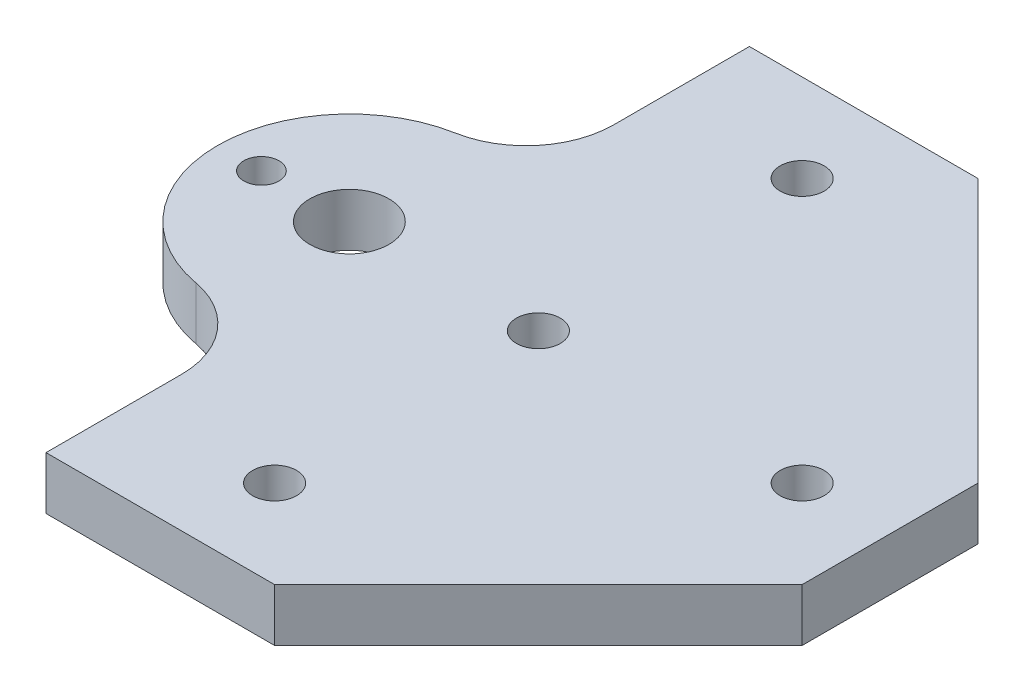
ISO-10303-21;
HEADER;
FILE_DESCRIPTION(('STEP AP214'),'2;1');
FILE_NAME('part.step','',(''),(''),'','','');
FILE_SCHEMA(('AUTOMOTIVE_DESIGN { 1 0 10303 214 1 1 1 1 }'));
ENDSEC;
DATA;
#1=APPLICATION_CONTEXT('core data for automotive mechanical design processes');
#2=APPLICATION_PROTOCOL_DEFINITION('international standard','automotive_design',2000,#1);
#3=PRODUCT_CONTEXT('',#1,'mechanical');
#4=PRODUCT('Part','Part','',(#3));
#5=PRODUCT_RELATED_PRODUCT_CATEGORY('part','',(#4));
#6=PRODUCT_DEFINITION_FORMATION('','',#4);
#7=PRODUCT_DEFINITION_CONTEXT('part definition',#1,'design');
#8=PRODUCT_DEFINITION('design','',#6,#7);
#9=PRODUCT_DEFINITION_SHAPE('','',#8);
#10=(LENGTH_UNIT() NAMED_UNIT(*) SI_UNIT(.MILLI.,.METRE.));
#11=(NAMED_UNIT(*) PLANE_ANGLE_UNIT() SI_UNIT($,.RADIAN.));
#12=(NAMED_UNIT(*) SI_UNIT($,.STERADIAN.) SOLID_ANGLE_UNIT());
#13=UNCERTAINTY_MEASURE_WITH_UNIT(LENGTH_MEASURE(1.E-05),#10,'distance_accuracy_value','');
#14=(GEOMETRIC_REPRESENTATION_CONTEXT(3) GLOBAL_UNCERTAINTY_ASSIGNED_CONTEXT((#13)) GLOBAL_UNIT_ASSIGNED_CONTEXT((#10,
#11,#12)) REPRESENTATION_CONTEXT('',''));
#15=CARTESIAN_POINT('',(0.,0.,0.));
#16=DIRECTION('',(0.,0.,1.));
#17=DIRECTION('',(1.,0.,0.));
#18=AXIS2_PLACEMENT_3D('',#15,#16,#17);
#19=CARTESIAN_POINT('',(0.,6.,0.));
#20=DIRECTION('',(-1.,0.,0.));
#21=DIRECTION('',(0.,0.,1.));
#22=AXIS2_PLACEMENT_3D('',#19,#20,#21);
#23=PLANE('',#22);
#24=DIRECTION('',(0.,0.,-1.));
#25=VECTOR('',#24,1.);
#26=CARTESIAN_POINT('',(0.,0.,0.));
#27=LINE('',#26,#25);
#28=CARTESIAN_POINT('',(0.,0.,10.));
#29=VERTEX_POINT('',#28);
#30=CARTESIAN_POINT('',(0.,0.,-10.));
#31=VERTEX_POINT('',#30);
#32=EDGE_CURVE('E122',#29,#31,#27,.T.);
#33=ORIENTED_EDGE('',*,*,#32,.T.);
#34=DIRECTION('',(0.,-1.,0.));
#35=VECTOR('',#34,1.);
#36=CARTESIAN_POINT('',(0.,6.,-10.));
#37=LINE('',#36,#35);
#38=CARTESIAN_POINT('',(0.,6.,-10.));
#39=VERTEX_POINT('',#38);
#40=EDGE_CURVE('E121',#39,#31,#37,.T.);
#41=ORIENTED_EDGE('',*,*,#40,.F.);
#42=DIRECTION('',(0.,0.,-1.));
#43=VECTOR('',#42,1.);
#44=CARTESIAN_POINT('',(0.,6.,10.));
#45=LINE('',#44,#43);
#46=CARTESIAN_POINT('',(0.,6.,10.));
#47=VERTEX_POINT('',#46);
#48=EDGE_CURVE('E107',#47,#39,#45,.T.);
#49=ORIENTED_EDGE('',*,*,#48,.F.);
#50=DIRECTION('',(0.,-1.,0.));
#51=VECTOR('',#50,1.);
#52=CARTESIAN_POINT('',(0.,6.,10.));
#53=LINE('',#52,#51);
#54=EDGE_CURVE('E146',#47,#29,#53,.T.);
#55=ORIENTED_EDGE('',*,*,#54,.T.);
#56=EDGE_LOOP('',(#33,#41,#49,#55));
#57=FACE_BOUND('',#56,.T.);
#58=ADVANCED_FACE('F33',(#57),#23,.F.);
#59=CARTESIAN_POINT('',(0.,6.,-10.));
#60=DIRECTION('',(-0.707106781186548,0.,0.707106781186547));
#61=DIRECTION('',(0.707106781186547,0.,0.707106781186548));
#62=AXIS2_PLACEMENT_3D('',#59,#60,#61);
#63=PLANE('',#62);
#64=DIRECTION('',(-0.707106781186547,0.,-0.707106781186549));
#65=VECTOR('',#64,1.);
#66=CARTESIAN_POINT('',(0.,0.,-10.));
#67=LINE('',#66,#65);
#68=CARTESIAN_POINT('',(-30.,0.,-40.0000000000001));
#69=VERTEX_POINT('',#68);
#70=EDGE_CURVE('E148',#31,#69,#67,.T.);
#71=ORIENTED_EDGE('',*,*,#70,.T.);
#72=DIRECTION('',(0.,-1.,0.));
#73=VECTOR('',#72,1.);
#74=CARTESIAN_POINT('',(-30.,6.,-40.0000000000001));
#75=LINE('',#74,#73);
#76=CARTESIAN_POINT('',(-30.,6.,-40.0000000000001));
#77=VERTEX_POINT('',#76);
#78=EDGE_CURVE('E126',#77,#69,#75,.T.);
#79=ORIENTED_EDGE('',*,*,#78,.F.);
#80=DIRECTION('',(-0.707106781186547,0.,-0.707106781186549));
#81=VECTOR('',#80,1.);
#82=CARTESIAN_POINT('',(0.,6.,-10.));
#83=LINE('',#82,#81);
#84=EDGE_CURVE('E111',#39,#77,#83,.T.);
#85=ORIENTED_EDGE('',*,*,#84,.F.);
#86=ORIENTED_EDGE('',*,*,#40,.T.);
#87=EDGE_LOOP('',(#71,#79,#85,#86));
#88=FACE_BOUND('',#87,.T.);
#89=ADVANCED_FACE('F128',(#88),#63,.F.);
#90=CARTESIAN_POINT('',(-30.,6.,-40.0000000000001));
#91=DIRECTION('',(0.,0.,1.));
#92=DIRECTION('',(1.,0.,0.));
#93=AXIS2_PLACEMENT_3D('',#90,#91,#92);
#94=PLANE('',#93);
#95=DIRECTION('',(-1.,0.,0.));
#96=VECTOR('',#95,1.);
#97=CARTESIAN_POINT('',(-30.,0.,-40.0000000000001));
#98=LINE('',#97,#96);
#99=CARTESIAN_POINT('',(-56.,0.,-40.0000000000001));
#100=VERTEX_POINT('',#99);
#101=EDGE_CURVE('E151',#69,#100,#98,.T.);
#102=ORIENTED_EDGE('',*,*,#101,.T.);
#103=DIRECTION('',(0.,-1.,0.));
#104=VECTOR('',#103,1.);
#105=CARTESIAN_POINT('',(-56.,6.,-40.0000000000001));
#106=LINE('',#105,#104);
#107=CARTESIAN_POINT('',(-56.,6.,-40.0000000000001));
#108=VERTEX_POINT('',#107);
#109=EDGE_CURVE('E172',#108,#100,#106,.T.);
#110=ORIENTED_EDGE('',*,*,#109,.F.);
#111=DIRECTION('',(-1.,0.,0.));
#112=VECTOR('',#111,1.);
#113=CARTESIAN_POINT('',(-30.,6.,-40.0000000000001));
#114=LINE('',#113,#112);
#115=EDGE_CURVE('E131',#77,#108,#114,.T.);
#116=ORIENTED_EDGE('',*,*,#115,.F.);
#117=ORIENTED_EDGE('',*,*,#78,.T.);
#118=EDGE_LOOP('',(#102,#110,#116,#117));
#119=FACE_BOUND('',#118,.T.);
#120=ADVANCED_FACE('F209',(#119),#94,.F.);
#121=CARTESIAN_POINT('',(-56.,6.,-40.0000000000001));
#122=DIRECTION('',(1.,0.,0.));
#123=DIRECTION('',(0.,0.,-1.));
#124=AXIS2_PLACEMENT_3D('',#121,#122,#123);
#125=PLANE('',#124);
#126=DIRECTION('',(0.,0.,1.));
#127=VECTOR('',#126,1.);
#128=CARTESIAN_POINT('',(-56.,0.,-40.0000000000001));
#129=LINE('',#128,#127);
#130=CARTESIAN_POINT('',(-56.,0.,-24.591665254716));
#131=VERTEX_POINT('',#130);
#132=EDGE_CURVE('E153',#100,#131,#129,.T.);
#133=ORIENTED_EDGE('',*,*,#132,.T.);
#134=DIRECTION('',(0.,1.,0.));
#135=VECTOR('',#134,1.);
#136=CARTESIAN_POINT('',(-56.,6.,-24.591665254716));
#137=LINE('',#136,#135);
#138=CARTESIAN_POINT('',(-56.,6.,-24.591665254716));
#139=VERTEX_POINT('',#138);
#140=EDGE_CURVE('E180',#131,#139,#137,.T.);
#141=ORIENTED_EDGE('',*,*,#140,.T.);
#142=DIRECTION('',(0.,0.,1.));
#143=VECTOR('',#142,1.);
#144=CARTESIAN_POINT('',(-56.,6.,-40.0000000000001));
#145=LINE('',#144,#143);
#146=EDGE_CURVE('E133',#108,#139,#145,.T.);
#147=ORIENTED_EDGE('',*,*,#146,.F.);
#148=ORIENTED_EDGE('',*,*,#109,.T.);
#149=EDGE_LOOP('',(#133,#141,#147,#148));
#150=FACE_BOUND('',#149,.T.);
#151=ADVANCED_FACE('F217',(#150),#125,.F.);
#152=CARTESIAN_POINT('',(-61.5,6.,-1.04922693038559E-13));
#153=DIRECTION('',(0.,-1.,0.));
#154=DIRECTION('',(0.,0.,-1.));
#155=AXIS2_PLACEMENT_3D('',#152,#153,#154);
#156=CYLINDRICAL_SURFACE('',#155,15.);
#157=CARTESIAN_POINT('',(-61.5,6.,-1.04922693038559E-13));
#158=DIRECTION('',(0.,1.,0.));
#159=DIRECTION('',(0.,0.,1.));
#160=AXIS2_PLACEMENT_3D('',#157,#158,#159);
#161=CIRCLE('',#160,15.);
#162=CARTESIAN_POINT('',(-64.2,6.,-14.7549991528297));
#163=VERTEX_POINT('',#162);
#164=CARTESIAN_POINT('',(-64.2,6.,14.7549991528295));
#165=VERTEX_POINT('',#164);
#166=EDGE_CURVE('E139',#163,#165,#161,.T.);
#167=ORIENTED_EDGE('',*,*,#166,.F.);
#168=DIRECTION('',(0.,-1.,0.));
#169=VECTOR('',#168,1.);
#170=CARTESIAN_POINT('',(-64.2,6.,-14.7549991528297));
#171=LINE('',#170,#169);
#172=CARTESIAN_POINT('',(-64.2,0.,-14.7549991528297));
#173=VERTEX_POINT('',#172);
#174=EDGE_CURVE('E177',#163,#173,#171,.T.);
#175=ORIENTED_EDGE('',*,*,#174,.T.);
#176=CARTESIAN_POINT('',(-61.5,0.,-1.04922693038559E-13));
#177=DIRECTION('',(0.,1.,0.));
#178=DIRECTION('',(0.,0.,1.));
#179=AXIS2_PLACEMENT_3D('',#176,#177,#178);
#180=CIRCLE('',#179,15.);
#181=CARTESIAN_POINT('',(-64.2,0.,14.7549991528295));
#182=VERTEX_POINT('',#181);
#183=EDGE_CURVE('E156',#173,#182,#180,.T.);
#184=ORIENTED_EDGE('',*,*,#183,.T.);
#185=DIRECTION('',(0.,-1.,0.));
#186=VECTOR('',#185,1.);
#187=CARTESIAN_POINT('',(-64.2,6.,14.7549991528295));
#188=LINE('',#187,#186);
#189=EDGE_CURVE('E125',#182,#165,#188,.F.);
#190=ORIENTED_EDGE('',*,*,#189,.T.);
#191=EDGE_LOOP('',(#167,#175,#184,#190));
#192=FACE_BOUND('',#191,.T.);
#193=ADVANCED_FACE('F194',(#192),#156,.T.);
#194=CARTESIAN_POINT('',(-56.,6.,13.9552857369528));
#195=DIRECTION('',(1.,0.,0.));
#196=DIRECTION('',(0.,0.,-1.));
#197=AXIS2_PLACEMENT_3D('',#194,#195,#196);
#198=PLANE('',#197);
#199=DIRECTION('',(0.,0.,1.));
#200=VECTOR('',#199,1.);
#201=CARTESIAN_POINT('',(-56.,6.,13.9552857369528));
#202=LINE('',#201,#200);
#203=CARTESIAN_POINT('',(-56.,6.,24.5916652547158));
#204=VERTEX_POINT('',#203);
#205=CARTESIAN_POINT('',(-56.,6.,39.9999999999999));
#206=VERTEX_POINT('',#205);
#207=EDGE_CURVE('E141',#204,#206,#202,.T.);
#208=ORIENTED_EDGE('',*,*,#207,.F.);
#209=DIRECTION('',(0.,1.,0.));
#210=VECTOR('',#209,1.);
#211=CARTESIAN_POINT('',(-56.,0.,24.5916652547158));
#212=LINE('',#211,#210);
#213=CARTESIAN_POINT('',(-56.,0.,24.5916652547158));
#214=VERTEX_POINT('',#213);
#215=EDGE_CURVE('E182',#204,#214,#212,.F.);
#216=ORIENTED_EDGE('',*,*,#215,.T.);
#217=DIRECTION('',(0.,0.,1.));
#218=VECTOR('',#217,1.);
#219=CARTESIAN_POINT('',(-56.,0.,13.9552857369528));
#220=LINE('',#219,#218);
#221=CARTESIAN_POINT('',(-56.,0.,39.9999999999999));
#222=VERTEX_POINT('',#221);
#223=EDGE_CURVE('E159',#214,#222,#220,.T.);
#224=ORIENTED_EDGE('',*,*,#223,.T.);
#225=DIRECTION('',(0.,-1.,0.));
#226=VECTOR('',#225,1.);
#227=CARTESIAN_POINT('',(-56.,6.,39.9999999999999));
#228=LINE('',#227,#226);
#229=EDGE_CURVE('E169',#206,#222,#228,.T.);
#230=ORIENTED_EDGE('',*,*,#229,.F.);
#231=EDGE_LOOP('',(#208,#216,#224,#230));
#232=FACE_BOUND('',#231,.T.);
#233=ADVANCED_FACE('F197',(#232),#198,.F.);
#234=CARTESIAN_POINT('',(-56.,6.,39.9999999999999));
#235=DIRECTION('',(0.,0.,-1.));
#236=DIRECTION('',(-1.,0.,0.));
#237=AXIS2_PLACEMENT_3D('',#234,#235,#236);
#238=PLANE('',#237);
#239=DIRECTION('',(1.,0.,0.));
#240=VECTOR('',#239,1.);
#241=CARTESIAN_POINT('',(-56.,0.,39.9999999999999));
#242=LINE('',#241,#240);
#243=CARTESIAN_POINT('',(-30.,0.,39.9999999999999));
#244=VERTEX_POINT('',#243);
#245=EDGE_CURVE('E161',#222,#244,#242,.T.);
#246=ORIENTED_EDGE('',*,*,#245,.T.);
#247=DIRECTION('',(0.,-1.,0.));
#248=VECTOR('',#247,1.);
#249=CARTESIAN_POINT('',(-30.,6.,39.9999999999999));
#250=LINE('',#249,#248);
#251=CARTESIAN_POINT('',(-30.,6.,39.9999999999999));
#252=VERTEX_POINT('',#251);
#253=EDGE_CURVE('E166',#252,#244,#250,.T.);
#254=ORIENTED_EDGE('',*,*,#253,.F.);
#255=DIRECTION('',(1.,0.,0.));
#256=VECTOR('',#255,1.);
#257=CARTESIAN_POINT('',(-56.,6.,39.9999999999999));
#258=LINE('',#257,#256);
#259=EDGE_CURVE('E143',#206,#252,#258,.T.);
#260=ORIENTED_EDGE('',*,*,#259,.F.);
#261=ORIENTED_EDGE('',*,*,#229,.T.);
#262=EDGE_LOOP('',(#246,#254,#260,#261));
#263=FACE_BOUND('',#262,.T.);
#264=ADVANCED_FACE('F202',(#263),#238,.F.);
#265=CARTESIAN_POINT('',(-30.,6.,39.9999999999999));
#266=DIRECTION('',(-0.707106781186546,0.,-0.707106781186549));
#267=DIRECTION('',(-0.707106781186549,0.,0.707106781186546));
#268=AXIS2_PLACEMENT_3D('',#265,#266,#267);
#269=PLANE('',#268);
#270=DIRECTION('',(0.707106781186549,0.,-0.707106781186546));
#271=VECTOR('',#270,1.);
#272=CARTESIAN_POINT('',(-30.,0.,39.9999999999999));
#273=LINE('',#272,#271);
#274=EDGE_CURVE('E118',#244,#29,#273,.T.);
#275=ORIENTED_EDGE('',*,*,#274,.T.);
#276=ORIENTED_EDGE('',*,*,#54,.F.);
#277=DIRECTION('',(0.707106781186549,0.,-0.707106781186546));
#278=VECTOR('',#277,1.);
#279=CARTESIAN_POINT('',(-30.,6.,39.9999999999999));
#280=LINE('',#279,#278);
#281=EDGE_CURVE('E114',#252,#47,#280,.T.);
#282=ORIENTED_EDGE('',*,*,#281,.F.);
#283=ORIENTED_EDGE('',*,*,#253,.T.);
#284=EDGE_LOOP('',(#275,#276,#282,#283));
#285=FACE_BOUND('',#284,.T.);
#286=ADVANCED_FACE('F205',(#285),#269,.F.);
#287=CARTESIAN_POINT('',(-61.5,6.,-1.04922693038559E-13));
#288=DIRECTION('',(0.,1.,0.));
#289=DIRECTION('',(0.,0.,1.));
#290=AXIS2_PLACEMENT_3D('',#287,#288,#289);
#291=PLANE('',#290);
#292=CARTESIAN_POINT('',(-71.5,6.,0.));
#293=DIRECTION('',(0.,1.,0.));
#294=DIRECTION('',(0.,0.,1.));
#295=AXIS2_PLACEMENT_3D('',#292,#293,#294);
#296=CIRCLE('',#295,2.);
#297=CARTESIAN_POINT('',(-71.5,6.,2.));
#298=VERTEX_POINT('',#297);
#299=EDGE_CURVE('E346',#298,#298,#296,.T.);
#300=ORIENTED_EDGE('',*,*,#299,.F.);
#301=EDGE_LOOP('',(#300));
#302=FACE_BOUND('',#301,.T.);
#303=CARTESIAN_POINT('',(-61.5,6.,-1.04922693038559E-13));
#304=DIRECTION('',(0.,1.,0.));
#305=DIRECTION('',(0.,0.,1.));
#306=AXIS2_PLACEMENT_3D('',#303,#304,#305);
#307=CIRCLE('',#306,4.5);
#308=CARTESIAN_POINT('',(-61.5,6.,4.49999999999989));
#309=VERTEX_POINT('',#308);
#310=EDGE_CURVE('E348',#309,#309,#307,.T.);
#311=ORIENTED_EDGE('',*,*,#310,.F.);
#312=EDGE_LOOP('',(#311));
#313=FACE_BOUND('',#312,.T.);
#314=CARTESIAN_POINT('',(-40.,6.,-30.0000000000001));
#315=DIRECTION('',(0.,1.,0.));
#316=DIRECTION('',(0.,0.,1.));
#317=AXIS2_PLACEMENT_3D('',#314,#315,#316);
#318=CIRCLE('',#317,2.5);
#319=CARTESIAN_POINT('',(-40.,6.,-27.5000000000001));
#320=VERTEX_POINT('',#319);
#321=EDGE_CURVE('E354',#320,#320,#318,.T.);
#322=ORIENTED_EDGE('',*,*,#321,.F.);
#323=EDGE_LOOP('',(#322));
#324=FACE_BOUND('',#323,.T.);
#325=CARTESIAN_POINT('',(-10.,6.,0.));
#326=DIRECTION('',(0.,1.,0.));
#327=DIRECTION('',(0.,0.,1.));
#328=AXIS2_PLACEMENT_3D('',#325,#326,#327);
#329=CIRCLE('',#328,2.5);
#330=CARTESIAN_POINT('',(-10.,6.,2.5));
#331=VERTEX_POINT('',#330);
#332=EDGE_CURVE('E360',#331,#331,#329,.T.);
#333=ORIENTED_EDGE('',*,*,#332,.F.);
#334=EDGE_LOOP('',(#333));
#335=FACE_BOUND('',#334,.T.);
#336=CARTESIAN_POINT('',(-40.,6.,29.9999999999999));
#337=DIRECTION('',(0.,1.,0.));
#338=DIRECTION('',(0.,0.,1.));
#339=AXIS2_PLACEMENT_3D('',#336,#337,#338);
#340=CIRCLE('',#339,2.5);
#341=CARTESIAN_POINT('',(-40.,6.,32.4999999999999));
#342=VERTEX_POINT('',#341);
#343=EDGE_CURVE('E366',#342,#342,#340,.T.);
#344=ORIENTED_EDGE('',*,*,#343,.F.);
#345=EDGE_LOOP('',(#344));
#346=FACE_BOUND('',#345,.T.);
#347=CARTESIAN_POINT('',(-40.,6.,0.));
#348=DIRECTION('',(0.,1.,0.));
#349=DIRECTION('',(0.,0.,1.));
#350=AXIS2_PLACEMENT_3D('',#347,#348,#349);
#351=CIRCLE('',#350,2.5);
#352=CARTESIAN_POINT('',(-40.,6.,2.49999999999991));
#353=VERTEX_POINT('',#352);
#354=EDGE_CURVE('E372',#353,#353,#351,.T.);
#355=ORIENTED_EDGE('',*,*,#354,.F.);
#356=EDGE_LOOP('',(#355));
#357=FACE_BOUND('',#356,.T.);
#358=ORIENTED_EDGE('',*,*,#48,.T.);
#359=ORIENTED_EDGE('',*,*,#84,.T.);
#360=ORIENTED_EDGE('',*,*,#115,.T.);
#361=ORIENTED_EDGE('',*,*,#146,.T.);
#362=CARTESIAN_POINT('',(-66.,6.,-24.591665254716));
#363=DIRECTION('',(0.,1.,0.));
#364=DIRECTION('',(0.,0.,1.));
#365=AXIS2_PLACEMENT_3D('',#362,#363,#364);
#366=CIRCLE('',#365,10.);
#367=EDGE_CURVE('E186',#139,#163,#366,.F.);
#368=ORIENTED_EDGE('',*,*,#367,.T.);
#369=ORIENTED_EDGE('',*,*,#166,.T.);
#370=CARTESIAN_POINT('',(-66.,6.,24.5916652547158));
#371=DIRECTION('',(0.,1.,0.));
#372=DIRECTION('',(0.,0.,1.));
#373=AXIS2_PLACEMENT_3D('',#370,#371,#372);
#374=CIRCLE('',#373,10.);
#375=EDGE_CURVE('E11',#165,#204,#374,.F.);
#376=ORIENTED_EDGE('',*,*,#375,.T.);
#377=ORIENTED_EDGE('',*,*,#207,.T.);
#378=ORIENTED_EDGE('',*,*,#259,.T.);
#379=ORIENTED_EDGE('',*,*,#281,.T.);
#380=EDGE_LOOP('',(#358,#359,#360,#361,#368,#369,#376,#377,#378,#379));
#381=FACE_BOUND('',#380,.T.);
#382=ADVANCED_FACE('F109',(#302,#313,#324,#335,#346,#357,#381),#291,.T.);
#383=CARTESIAN_POINT('',(-61.5,0.,-1.04922693038559E-13));
#384=DIRECTION('',(0.,1.,0.));
#385=DIRECTION('',(0.,0.,1.));
#386=AXIS2_PLACEMENT_3D('',#383,#384,#385);
#387=PLANE('',#386);
#388=CARTESIAN_POINT('',(-71.5,0.,0.));
#389=DIRECTION('',(0.,1.,0.));
#390=DIRECTION('',(0.,0.,1.));
#391=AXIS2_PLACEMENT_3D('',#388,#389,#390);
#392=CIRCLE('',#391,2.);
#393=CARTESIAN_POINT('',(-71.5,0.,2.));
#394=VERTEX_POINT('',#393);
#395=EDGE_CURVE('E343',#394,#394,#392,.T.);
#396=ORIENTED_EDGE('',*,*,#395,.T.);
#397=EDGE_LOOP('',(#396));
#398=FACE_BOUND('',#397,.T.);
#399=CARTESIAN_POINT('',(-61.5,0.,-1.04922693038559E-13));
#400=DIRECTION('',(0.,1.,0.));
#401=DIRECTION('',(0.,0.,1.));
#402=AXIS2_PLACEMENT_3D('',#399,#400,#401);
#403=CIRCLE('',#402,4.5);
#404=CARTESIAN_POINT('',(-61.5,0.,4.49999999999989));
#405=VERTEX_POINT('',#404);
#406=EDGE_CURVE('E351',#405,#405,#403,.T.);
#407=ORIENTED_EDGE('',*,*,#406,.T.);
#408=EDGE_LOOP('',(#407));
#409=FACE_BOUND('',#408,.T.);
#410=CARTESIAN_POINT('',(-40.,0.,-30.0000000000001));
#411=DIRECTION('',(0.,1.,0.));
#412=DIRECTION('',(0.,0.,1.));
#413=AXIS2_PLACEMENT_3D('',#410,#411,#412);
#414=CIRCLE('',#413,2.5);
#415=CARTESIAN_POINT('',(-40.,0.,-27.5000000000001));
#416=VERTEX_POINT('',#415);
#417=EDGE_CURVE('E357',#416,#416,#414,.T.);
#418=ORIENTED_EDGE('',*,*,#417,.T.);
#419=EDGE_LOOP('',(#418));
#420=FACE_BOUND('',#419,.T.);
#421=CARTESIAN_POINT('',(-10.,0.,0.));
#422=DIRECTION('',(0.,1.,0.));
#423=DIRECTION('',(0.,0.,1.));
#424=AXIS2_PLACEMENT_3D('',#421,#422,#423);
#425=CIRCLE('',#424,2.5);
#426=CARTESIAN_POINT('',(-10.,0.,2.5));
#427=VERTEX_POINT('',#426);
#428=EDGE_CURVE('E363',#427,#427,#425,.T.);
#429=ORIENTED_EDGE('',*,*,#428,.T.);
#430=EDGE_LOOP('',(#429));
#431=FACE_BOUND('',#430,.T.);
#432=CARTESIAN_POINT('',(-40.,0.,29.9999999999999));
#433=DIRECTION('',(0.,1.,0.));
#434=DIRECTION('',(0.,0.,1.));
#435=AXIS2_PLACEMENT_3D('',#432,#433,#434);
#436=CIRCLE('',#435,2.5);
#437=CARTESIAN_POINT('',(-40.,0.,32.4999999999999));
#438=VERTEX_POINT('',#437);
#439=EDGE_CURVE('E369',#438,#438,#436,.T.);
#440=ORIENTED_EDGE('',*,*,#439,.T.);
#441=EDGE_LOOP('',(#440));
#442=FACE_BOUND('',#441,.T.);
#443=CARTESIAN_POINT('',(-40.,0.,0.));
#444=DIRECTION('',(0.,1.,0.));
#445=DIRECTION('',(0.,0.,1.));
#446=AXIS2_PLACEMENT_3D('',#443,#444,#445);
#447=CIRCLE('',#446,2.5);
#448=CARTESIAN_POINT('',(-40.,0.,2.49999999999991));
#449=VERTEX_POINT('',#448);
#450=EDGE_CURVE('E149',#449,#449,#447,.T.);
#451=ORIENTED_EDGE('',*,*,#450,.T.);
#452=EDGE_LOOP('',(#451));
#453=FACE_BOUND('',#452,.T.);
#454=ORIENTED_EDGE('',*,*,#32,.F.);
#455=ORIENTED_EDGE('',*,*,#274,.F.);
#456=ORIENTED_EDGE('',*,*,#245,.F.);
#457=ORIENTED_EDGE('',*,*,#223,.F.);
#458=CARTESIAN_POINT('',(-66.,0.,24.5916652547158));
#459=DIRECTION('',(0.,1.,0.));
#460=DIRECTION('',(0.,0.,1.));
#461=AXIS2_PLACEMENT_3D('',#458,#459,#460);
#462=CIRCLE('',#461,10.);
#463=EDGE_CURVE('E41',#214,#182,#462,.T.);
#464=ORIENTED_EDGE('',*,*,#463,.T.);
#465=ORIENTED_EDGE('',*,*,#183,.F.);
#466=CARTESIAN_POINT('',(-66.,0.,-24.591665254716));
#467=DIRECTION('',(0.,1.,0.));
#468=DIRECTION('',(0.,0.,1.));
#469=AXIS2_PLACEMENT_3D('',#466,#467,#468);
#470=CIRCLE('',#469,10.);
#471=EDGE_CURVE('E184',#173,#131,#470,.T.);
#472=ORIENTED_EDGE('',*,*,#471,.T.);
#473=ORIENTED_EDGE('',*,*,#132,.F.);
#474=ORIENTED_EDGE('',*,*,#101,.F.);
#475=ORIENTED_EDGE('',*,*,#70,.F.);
#476=EDGE_LOOP('',(#454,#455,#456,#457,#464,#465,#472,#473,#474,#475));
#477=FACE_BOUND('',#476,.T.);
#478=ADVANCED_FACE('F190',(#398,#409,#420,#431,#442,#453,#477),#387,.F.);
#479=CARTESIAN_POINT('',(-66.,6.,-24.591665254716));
#480=DIRECTION('',(0.,-1.,0.));
#481=DIRECTION('',(0.,0.,-1.));
#482=AXIS2_PLACEMENT_3D('',#479,#480,#481);
#483=CYLINDRICAL_SURFACE('',#482,10.);
#484=ORIENTED_EDGE('',*,*,#367,.F.);
#485=ORIENTED_EDGE('',*,*,#140,.F.);
#486=ORIENTED_EDGE('',*,*,#471,.F.);
#487=ORIENTED_EDGE('',*,*,#174,.F.);
#488=EDGE_LOOP('',(#484,#485,#486,#487));
#489=FACE_BOUND('',#488,.T.);
#490=ADVANCED_FACE('F216',(#489),#483,.F.);
#491=CARTESIAN_POINT('',(-66.,6.,24.5916652547158));
#492=DIRECTION('',(0.,-1.,0.));
#493=DIRECTION('',(0.,0.,-1.));
#494=AXIS2_PLACEMENT_3D('',#491,#492,#493);
#495=CYLINDRICAL_SURFACE('',#494,10.);
#496=ORIENTED_EDGE('',*,*,#375,.F.);
#497=ORIENTED_EDGE('',*,*,#189,.F.);
#498=ORIENTED_EDGE('',*,*,#463,.F.);
#499=ORIENTED_EDGE('',*,*,#215,.F.);
#500=EDGE_LOOP('',(#496,#497,#498,#499));
#501=FACE_BOUND('',#500,.T.);
#502=ADVANCED_FACE('F35',(#501),#495,.F.);
#503=CARTESIAN_POINT('',(-40.,0.,0.));
#504=DIRECTION('',(0.,1.,0.));
#505=DIRECTION('',(0.,0.,1.));
#506=AXIS2_PLACEMENT_3D('',#503,#504,#505);
#507=CYLINDRICAL_SURFACE('',#506,2.5);
#508=ORIENTED_EDGE('',*,*,#450,.F.);
#509=EDGE_LOOP('',(#508));
#510=FACE_BOUND('',#509,.T.);
#511=ORIENTED_EDGE('',*,*,#354,.T.);
#512=EDGE_LOOP('',(#511));
#513=FACE_BOUND('',#512,.T.);
#514=ADVANCED_FACE('F237',(#510,#513),#507,.F.);
#515=CARTESIAN_POINT('',(-40.,0.,29.9999999999999));
#516=DIRECTION('',(0.,1.,0.));
#517=DIRECTION('',(0.,0.,1.));
#518=AXIS2_PLACEMENT_3D('',#515,#516,#517);
#519=CYLINDRICAL_SURFACE('',#518,2.5);
#520=ORIENTED_EDGE('',*,*,#439,.F.);
#521=EDGE_LOOP('',(#520));
#522=FACE_BOUND('',#521,.T.);
#523=ORIENTED_EDGE('',*,*,#343,.T.);
#524=EDGE_LOOP('',(#523));
#525=FACE_BOUND('',#524,.T.);
#526=ADVANCED_FACE('F288',(#522,#525),#519,.F.);
#527=CARTESIAN_POINT('',(-10.,0.,0.));
#528=DIRECTION('',(0.,1.,0.));
#529=DIRECTION('',(0.,0.,1.));
#530=AXIS2_PLACEMENT_3D('',#527,#528,#529);
#531=CYLINDRICAL_SURFACE('',#530,2.5);
#532=ORIENTED_EDGE('',*,*,#428,.F.);
#533=EDGE_LOOP('',(#532));
#534=FACE_BOUND('',#533,.T.);
#535=ORIENTED_EDGE('',*,*,#332,.T.);
#536=EDGE_LOOP('',(#535));
#537=FACE_BOUND('',#536,.T.);
#538=ADVANCED_FACE('F297',(#534,#537),#531,.F.);
#539=CARTESIAN_POINT('',(-40.,0.,-30.0000000000001));
#540=DIRECTION('',(0.,1.,0.));
#541=DIRECTION('',(0.,0.,1.));
#542=AXIS2_PLACEMENT_3D('',#539,#540,#541);
#543=CYLINDRICAL_SURFACE('',#542,2.5);
#544=ORIENTED_EDGE('',*,*,#417,.F.);
#545=EDGE_LOOP('',(#544));
#546=FACE_BOUND('',#545,.T.);
#547=ORIENTED_EDGE('',*,*,#321,.T.);
#548=EDGE_LOOP('',(#547));
#549=FACE_BOUND('',#548,.T.);
#550=ADVANCED_FACE('F307',(#546,#549),#543,.F.);
#551=CARTESIAN_POINT('',(-61.5,0.,-1.04922693038559E-13));
#552=DIRECTION('',(0.,1.,0.));
#553=DIRECTION('',(0.,0.,1.));
#554=AXIS2_PLACEMENT_3D('',#551,#552,#553);
#555=CYLINDRICAL_SURFACE('',#554,4.5);
#556=ORIENTED_EDGE('',*,*,#406,.F.);
#557=EDGE_LOOP('',(#556));
#558=FACE_BOUND('',#557,.T.);
#559=ORIENTED_EDGE('',*,*,#310,.T.);
#560=EDGE_LOOP('',(#559));
#561=FACE_BOUND('',#560,.T.);
#562=ADVANCED_FACE('F317',(#558,#561),#555,.F.);
#563=CARTESIAN_POINT('',(-71.5,0.,0.));
#564=DIRECTION('',(0.,1.,0.));
#565=DIRECTION('',(0.,0.,1.));
#566=AXIS2_PLACEMENT_3D('',#563,#564,#565);
#567=CYLINDRICAL_SURFACE('',#566,2.);
#568=ORIENTED_EDGE('',*,*,#395,.F.);
#569=EDGE_LOOP('',(#568));
#570=FACE_BOUND('',#569,.T.);
#571=ORIENTED_EDGE('',*,*,#299,.T.);
#572=EDGE_LOOP('',(#571));
#573=FACE_BOUND('',#572,.T.);
#574=ADVANCED_FACE('F327',(#570,#573),#567,.F.);
#575=CLOSED_SHELL('',(#58,#89,#120,#151,#193,#233,#264,#286,#382,#478,#490,#502,#514,#526,#538,
#550,#562,#574));
#576=MANIFOLD_SOLID_BREP('B2',#575);
#577=ADVANCED_BREP_SHAPE_REPRESENTATION('',(#18,#576),#14);
#578=SHAPE_DEFINITION_REPRESENTATION(#9,#577);
ENDSEC;
END-ISO-10303-21;
